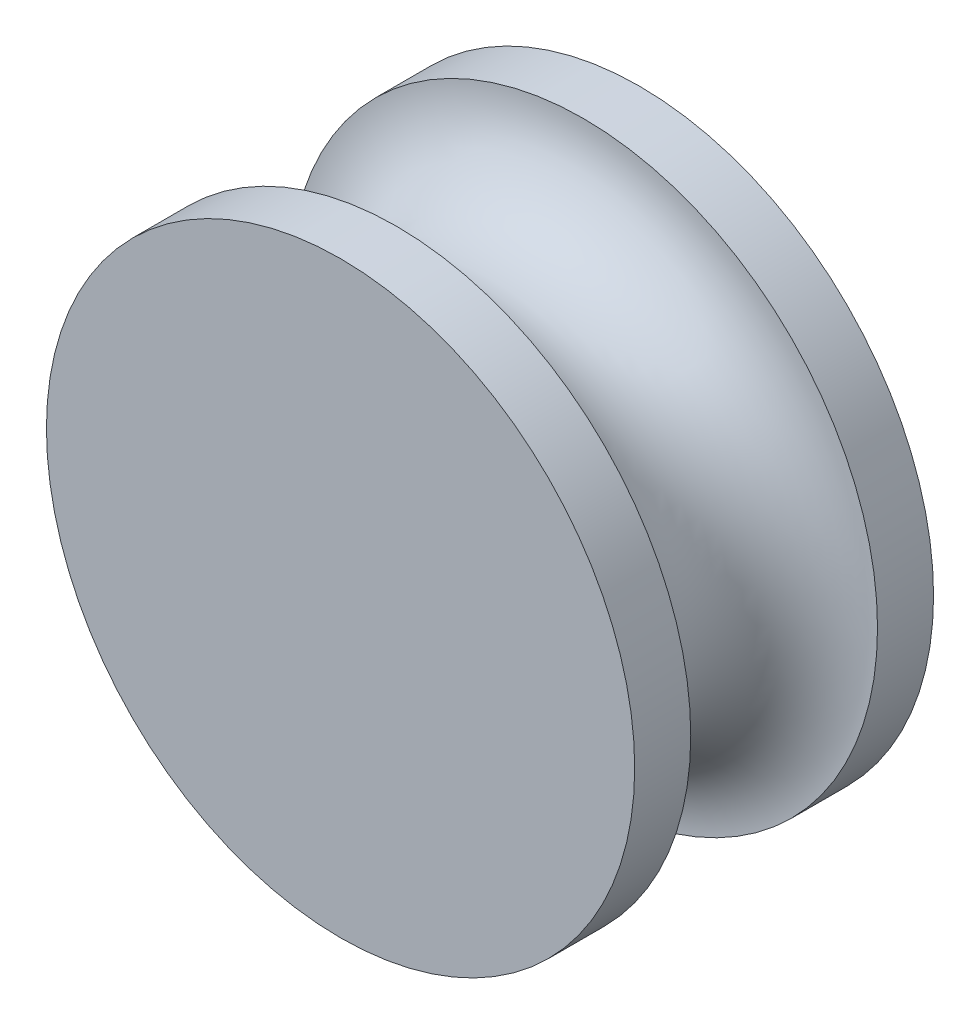
ISO-10303-21;
HEADER;
FILE_DESCRIPTION(('STEP AP214'),'2;1');
FILE_NAME('part.step','',(''),(''),'','','');
FILE_SCHEMA(('AUTOMOTIVE_DESIGN { 1 0 10303 214 1 1 1 1 }'));
ENDSEC;
DATA;
#1=APPLICATION_CONTEXT('core data for automotive mechanical design processes');
#2=APPLICATION_PROTOCOL_DEFINITION('international standard','automotive_design',2000,#1);
#3=PRODUCT_CONTEXT('',#1,'mechanical');
#4=PRODUCT('Part','Part','',(#3));
#5=PRODUCT_RELATED_PRODUCT_CATEGORY('part','',(#4));
#6=PRODUCT_DEFINITION_FORMATION('','',#4);
#7=PRODUCT_DEFINITION_CONTEXT('part definition',#1,'design');
#8=PRODUCT_DEFINITION('design','',#6,#7);
#9=PRODUCT_DEFINITION_SHAPE('','',#8);
#10=(LENGTH_UNIT() NAMED_UNIT(*) SI_UNIT(.MILLI.,.METRE.));
#11=(NAMED_UNIT(*) PLANE_ANGLE_UNIT() SI_UNIT($,.RADIAN.));
#12=(NAMED_UNIT(*) SI_UNIT($,.STERADIAN.) SOLID_ANGLE_UNIT());
#13=UNCERTAINTY_MEASURE_WITH_UNIT(LENGTH_MEASURE(1.E-05),#10,'distance_accuracy_value','');
#14=(GEOMETRIC_REPRESENTATION_CONTEXT(3) GLOBAL_UNCERTAINTY_ASSIGNED_CONTEXT((#13)) GLOBAL_UNIT_ASSIGNED_CONTEXT((#10,
#11,#12)) REPRESENTATION_CONTEXT('',''));
#15=CARTESIAN_POINT('',(0.,0.,0.));
#16=DIRECTION('',(0.,0.,1.));
#17=DIRECTION('',(1.,0.,0.));
#18=AXIS2_PLACEMENT_3D('',#15,#16,#17);
#19=CARTESIAN_POINT('',(0.,0.,12.7));
#20=DIRECTION('',(0.,0.,-1.));
#21=DIRECTION('',(-1.,0.,0.));
#22=AXIS2_PLACEMENT_3D('',#19,#20,#21);
#23=CYLINDRICAL_SURFACE('',#22,25.);
#24=CARTESIAN_POINT('',(0.,0.,7.9375));
#25=DIRECTION('',(0.,0.,1.));
#26=DIRECTION('',(1.,0.,0.));
#27=AXIS2_PLACEMENT_3D('',#24,#25,#26);
#28=CIRCLE('',#27,25.);
#29=CARTESIAN_POINT('',(25.,0.,7.9375));
#30=VERTEX_POINT('',#29);
#31=EDGE_CURVE('E55',#30,#30,#28,.T.);
#32=ORIENTED_EDGE('',*,*,#31,.T.);
#33=EDGE_LOOP('',(#32));
#34=FACE_BOUND('',#33,.T.);
#35=CARTESIAN_POINT('',(0.,0.,12.7));
#36=DIRECTION('',(0.,0.,1.));
#37=DIRECTION('',(1.,0.,0.));
#38=AXIS2_PLACEMENT_3D('',#35,#36,#37);
#39=CIRCLE('',#38,25.);
#40=CARTESIAN_POINT('',(25.,0.,12.7));
#41=VERTEX_POINT('',#40);
#42=EDGE_CURVE('E10',#41,#41,#39,.T.);
#43=ORIENTED_EDGE('',*,*,#42,.F.);
#44=EDGE_LOOP('',(#43));
#45=FACE_BOUND('',#44,.T.);
#46=ADVANCED_FACE('F37',(#34,#45),#23,.T.);
#47=CARTESIAN_POINT('',(0.,0.,12.7));
#48=DIRECTION('',(0.,0.,1.));
#49=DIRECTION('',(1.,0.,0.));
#50=AXIS2_PLACEMENT_3D('',#47,#48,#49);
#51=PLANE('',#50);
#52=ORIENTED_EDGE('',*,*,#42,.T.);
#53=EDGE_LOOP('',(#52));
#54=FACE_BOUND('',#53,.T.);
#55=ADVANCED_FACE('F66',(#54),#51,.T.);
#56=CARTESIAN_POINT('',(0.,0.,0.));
#57=DIRECTION('',(0.,0.,1.));
#58=DIRECTION('',(1.,0.,0.));
#59=AXIS2_PLACEMENT_3D('',#56,#57,#58);
#60=TOROIDAL_SURFACE('',#59,25.,7.9375);
#61=ORIENTED_EDGE('',*,*,#31,.F.);
#62=EDGE_LOOP('',(#61));
#63=FACE_BOUND('',#62,.T.);
#64=CARTESIAN_POINT('',(0.,0.,-7.9375));
#65=DIRECTION('',(0.,0.,1.));
#66=DIRECTION('',(1.,0.,0.));
#67=AXIS2_PLACEMENT_3D('',#64,#65,#66);
#68=CIRCLE('',#67,25.);
#69=CARTESIAN_POINT('',(25.,0.,-7.9375));
#70=VERTEX_POINT('',#69);
#71=EDGE_CURVE('E50',#70,#70,#68,.T.);
#72=ORIENTED_EDGE('',*,*,#71,.T.);
#73=EDGE_LOOP('',(#72));
#74=FACE_BOUND('',#73,.T.);
#75=ADVANCED_FACE('F62',(#63,#74),#60,.F.);
#76=CARTESIAN_POINT('',(0.,0.,-12.7));
#77=DIRECTION('',(0.,0.,1.));
#78=DIRECTION('',(1.,0.,0.));
#79=AXIS2_PLACEMENT_3D('',#76,#77,#78);
#80=PLANE('',#79);
#81=CARTESIAN_POINT('',(0.,0.,-12.7));
#82=DIRECTION('',(0.,0.,1.));
#83=DIRECTION('',(1.,0.,0.));
#84=AXIS2_PLACEMENT_3D('',#81,#82,#83);
#85=CIRCLE('',#84,25.);
#86=CARTESIAN_POINT('',(25.,0.,-12.7));
#87=VERTEX_POINT('',#86);
#88=EDGE_CURVE('E41',#87,#87,#85,.T.);
#89=ORIENTED_EDGE('',*,*,#88,.F.);
#90=EDGE_LOOP('',(#89));
#91=FACE_BOUND('',#90,.T.);
#92=ADVANCED_FACE('F65',(#91),#80,.F.);
#93=ORIENTED_EDGE('',*,*,#71,.F.);
#94=EDGE_LOOP('',(#93));
#95=FACE_BOUND('',#94,.T.);
#96=ORIENTED_EDGE('',*,*,#88,.T.);
#97=EDGE_LOOP('',(#96));
#98=FACE_BOUND('',#97,.T.);
#99=ADVANCED_FACE('F39',(#95,#98),#23,.T.);
#100=CLOSED_SHELL('',(#46,#55,#75,#92,#99));
#101=MANIFOLD_SOLID_BREP('B2',#100);
#102=ADVANCED_BREP_SHAPE_REPRESENTATION('',(#18,#101),#14);
#103=SHAPE_DEFINITION_REPRESENTATION(#9,#102);
ENDSEC;
END-ISO-10303-21;
